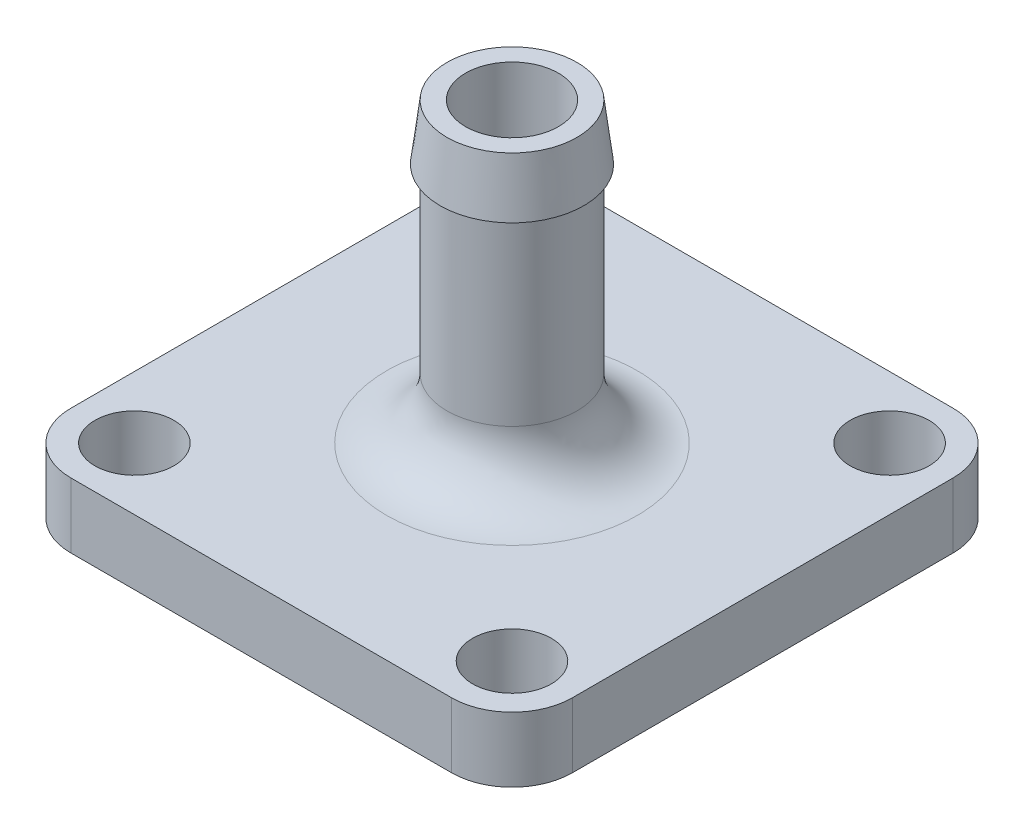
ISO-10303-21;
HEADER;
FILE_DESCRIPTION(('STEP AP214'),'2;1');
FILE_NAME('part.step','',(''),(''),'','','');
FILE_SCHEMA(('AUTOMOTIVE_DESIGN { 1 0 10303 214 1 1 1 1 }'));
ENDSEC;
DATA;
#1=APPLICATION_CONTEXT('core data for automotive mechanical design processes');
#2=APPLICATION_PROTOCOL_DEFINITION('international standard','automotive_design',2000,#1);
#3=PRODUCT_CONTEXT('',#1,'mechanical');
#4=PRODUCT('Part','Part','',(#3));
#5=PRODUCT_RELATED_PRODUCT_CATEGORY('part','',(#4));
#6=PRODUCT_DEFINITION_FORMATION('','',#4);
#7=PRODUCT_DEFINITION_CONTEXT('part definition',#1,'design');
#8=PRODUCT_DEFINITION('design','',#6,#7);
#9=PRODUCT_DEFINITION_SHAPE('','',#8);
#10=(LENGTH_UNIT() NAMED_UNIT(*) SI_UNIT(.MILLI.,.METRE.));
#11=(NAMED_UNIT(*) PLANE_ANGLE_UNIT() SI_UNIT($,.RADIAN.));
#12=(NAMED_UNIT(*) SI_UNIT($,.STERADIAN.) SOLID_ANGLE_UNIT());
#13=UNCERTAINTY_MEASURE_WITH_UNIT(LENGTH_MEASURE(1.E-05),#10,'distance_accuracy_value','');
#14=(GEOMETRIC_REPRESENTATION_CONTEXT(3) GLOBAL_UNCERTAINTY_ASSIGNED_CONTEXT((#13)) GLOBAL_UNIT_ASSIGNED_CONTEXT((#10,
#11,#12)) REPRESENTATION_CONTEXT('',''));
#15=CARTESIAN_POINT('',(0.,0.,0.));
#16=DIRECTION('',(0.,0.,1.));
#17=DIRECTION('',(1.,0.,0.));
#18=AXIS2_PLACEMENT_3D('',#15,#16,#17);
#19=CARTESIAN_POINT('',(0.,33.,0.));
#20=DIRECTION('',(0.,1.,0.));
#21=DIRECTION('',(0.,0.,1.));
#22=AXIS2_PLACEMENT_3D('',#19,#20,#21);
#23=PLANE('',#22);
#24=CARTESIAN_POINT('',(0.,33.,0.));
#25=DIRECTION('',(0.,1.,0.));
#26=DIRECTION('',(0.,0.,1.));
#27=AXIS2_PLACEMENT_3D('',#24,#25,#26);
#28=CIRCLE('',#27,7.);
#29=CARTESIAN_POINT('',(0.,33.,-7.));
#30=VERTEX_POINT('',#29);
#31=EDGE_CURVE('E266',#30,#30,#28,.T.);
#32=ORIENTED_EDGE('',*,*,#31,.T.);
#33=EDGE_LOOP('',(#32));
#34=FACE_BOUND('',#33,.T.);
#35=CARTESIAN_POINT('',(0.,33.,0.));
#36=DIRECTION('',(0.,1.,0.));
#37=DIRECTION('',(0.,0.,1.));
#38=AXIS2_PLACEMENT_3D('',#35,#36,#37);
#39=CIRCLE('',#38,7.73766141390782);
#40=CARTESIAN_POINT('',(0.,33.,7.73766141390782));
#41=VERTEX_POINT('',#40);
#42=EDGE_CURVE('E161',#41,#41,#39,.T.);
#43=ORIENTED_EDGE('',*,*,#42,.F.);
#44=EDGE_LOOP('',(#43));
#45=FACE_BOUND('',#44,.T.);
#46=ADVANCED_FACE('F33',(#34,#45),#23,.F.);
#47=CARTESIAN_POINT('',(0.,7.,0.));
#48=DIRECTION('',(0.,1.,0.));
#49=DIRECTION('',(0.,0.,1.));
#50=AXIS2_PLACEMENT_3D('',#47,#48,#49);
#51=PLANE('',#50);
#52=CARTESIAN_POINT('',(0.,7.,0.));
#53=DIRECTION('',(0.,1.,0.));
#54=DIRECTION('',(0.,0.,1.));
#55=AXIS2_PLACEMENT_3D('',#52,#53,#54);
#56=CIRCLE('',#55,13.5);
#57=CARTESIAN_POINT('',(0.,7.,13.5));
#58=VERTEX_POINT('',#57);
#59=EDGE_CURVE('E168',#58,#58,#56,.F.);
#60=ORIENTED_EDGE('',*,*,#59,.T.);
#61=EDGE_LOOP('',(#60));
#62=FACE_BOUND('',#61,.T.);
#63=CARTESIAN_POINT('',(-20.3293199591132,7.,20.3293199591132));
#64=DIRECTION('',(0.,1.,0.));
#65=DIRECTION('',(0.,0.,1.));
#66=AXIS2_PLACEMENT_3D('',#63,#64,#65);
#67=CIRCLE('',#66,4.25000000000001);
#68=CARTESIAN_POINT('',(-20.3293199591132,7.,24.5793199591133));
#69=VERTEX_POINT('',#68);
#70=EDGE_CURVE('E279',#69,#69,#67,.T.);
#71=ORIENTED_EDGE('',*,*,#70,.F.);
#72=EDGE_LOOP('',(#71));
#73=FACE_BOUND('',#72,.T.);
#74=CARTESIAN_POINT('',(-20.3293199591132,7.,-20.3293199591132));
#75=DIRECTION('',(0.,1.,0.));
#76=DIRECTION('',(0.,0.,1.));
#77=AXIS2_PLACEMENT_3D('',#74,#75,#76);
#78=CIRCLE('',#77,4.25);
#79=CARTESIAN_POINT('',(-20.3293199591132,7.,-16.0793199591132));
#80=VERTEX_POINT('',#79);
#81=EDGE_CURVE('E291',#80,#80,#78,.T.);
#82=ORIENTED_EDGE('',*,*,#81,.F.);
#83=EDGE_LOOP('',(#82));
#84=FACE_BOUND('',#83,.T.);
#85=DIRECTION('',(0.,0.,1.));
#86=VECTOR('',#85,1.);
#87=CARTESIAN_POINT('',(-27.,7.,-27.));
#88=LINE('',#87,#86);
#89=CARTESIAN_POINT('',(-27.,7.,-20.5));
#90=VERTEX_POINT('',#89);
#91=CARTESIAN_POINT('',(-27.,7.,20.5));
#92=VERTEX_POINT('',#91);
#93=EDGE_CURVE('E298',#90,#92,#88,.T.);
#94=ORIENTED_EDGE('',*,*,#93,.T.);
#95=CARTESIAN_POINT('',(-20.5,7.,20.5));
#96=DIRECTION('',(0.,1.,0.));
#97=DIRECTION('',(0.,0.,1.));
#98=AXIS2_PLACEMENT_3D('',#95,#96,#97);
#99=CIRCLE('',#98,6.5);
#100=CARTESIAN_POINT('',(-20.5,7.,27.));
#101=VERTEX_POINT('',#100);
#102=EDGE_CURVE('E149',#92,#101,#99,.T.);
#103=ORIENTED_EDGE('',*,*,#102,.T.);
#104=DIRECTION('',(1.,0.,0.));
#105=VECTOR('',#104,1.);
#106=CARTESIAN_POINT('',(-27.,7.,27.));
#107=LINE('',#106,#105);
#108=CARTESIAN_POINT('',(20.5,7.,27.));
#109=VERTEX_POINT('',#108);
#110=EDGE_CURVE('E120',#101,#109,#107,.T.);
#111=ORIENTED_EDGE('',*,*,#110,.T.);
#112=CARTESIAN_POINT('',(20.5,7.,20.5));
#113=DIRECTION('',(0.,1.,0.));
#114=DIRECTION('',(0.,0.,1.));
#115=AXIS2_PLACEMENT_3D('',#112,#113,#114);
#116=CIRCLE('',#115,6.5);
#117=CARTESIAN_POINT('',(27.,7.,20.5));
#118=VERTEX_POINT('',#117);
#119=EDGE_CURVE('E147',#109,#118,#116,.T.);
#120=ORIENTED_EDGE('',*,*,#119,.T.);
#121=DIRECTION('',(0.,0.,-1.));
#122=VECTOR('',#121,1.);
#123=CARTESIAN_POINT('',(27.,7.,-27.));
#124=LINE('',#123,#122);
#125=CARTESIAN_POINT('',(27.,7.,-20.5));
#126=VERTEX_POINT('',#125);
#127=EDGE_CURVE('E127',#118,#126,#124,.T.);
#128=ORIENTED_EDGE('',*,*,#127,.T.);
#129=CARTESIAN_POINT('',(20.5,7.,-20.5));
#130=DIRECTION('',(0.,1.,0.));
#131=DIRECTION('',(0.,0.,1.));
#132=AXIS2_PLACEMENT_3D('',#129,#130,#131);
#133=CIRCLE('',#132,6.5);
#134=CARTESIAN_POINT('',(20.5,7.,-27.));
#135=VERTEX_POINT('',#134);
#136=EDGE_CURVE('E55',#126,#135,#133,.T.);
#137=ORIENTED_EDGE('',*,*,#136,.T.);
#138=DIRECTION('',(-1.,0.,0.));
#139=VECTOR('',#138,1.);
#140=CARTESIAN_POINT('',(-27.,7.,-27.));
#141=LINE('',#140,#139);
#142=CARTESIAN_POINT('',(-20.5,7.,-27.));
#143=VERTEX_POINT('',#142);
#144=EDGE_CURVE('E130',#135,#143,#141,.T.);
#145=ORIENTED_EDGE('',*,*,#144,.T.);
#146=CARTESIAN_POINT('',(-20.5,7.,-20.5));
#147=DIRECTION('',(0.,1.,0.));
#148=DIRECTION('',(0.,0.,1.));
#149=AXIS2_PLACEMENT_3D('',#146,#147,#148);
#150=CIRCLE('',#149,6.5);
#151=EDGE_CURVE('E144',#143,#90,#150,.T.);
#152=ORIENTED_EDGE('',*,*,#151,.T.);
#153=EDGE_LOOP('',(#94,#103,#111,#120,#128,#137,#145,#152));
#154=FACE_BOUND('',#153,.T.);
#155=CARTESIAN_POINT('',(20.3293199591132,7.,20.3293199591132));
#156=DIRECTION('',(0.,1.,0.));
#157=DIRECTION('',(0.,0.,-1.));
#158=AXIS2_PLACEMENT_3D('',#155,#156,#157);
#159=CIRCLE('',#158,4.25000000000001);
#160=CARTESIAN_POINT('',(20.3293199591132,7.,16.0793199591132));
#161=VERTEX_POINT('',#160);
#162=EDGE_CURVE('E285',#161,#161,#159,.T.);
#163=ORIENTED_EDGE('',*,*,#162,.F.);
#164=EDGE_LOOP('',(#163));
#165=FACE_BOUND('',#164,.T.);
#166=CARTESIAN_POINT('',(20.3293199591132,7.,-20.3293199591133));
#167=DIRECTION('',(0.,1.,0.));
#168=DIRECTION('',(0.,0.,-1.));
#169=AXIS2_PLACEMENT_3D('',#166,#167,#168);
#170=CIRCLE('',#169,4.25);
#171=CARTESIAN_POINT('',(20.3293199591132,7.,-24.5793199591133));
#172=VERTEX_POINT('',#171);
#173=EDGE_CURVE('E270',#172,#172,#170,.T.);
#174=ORIENTED_EDGE('',*,*,#173,.F.);
#175=EDGE_LOOP('',(#174));
#176=FACE_BOUND('',#175,.T.);
#177=ADVANCED_FACE('F191',(#62,#73,#84,#154,#165,#176),#51,.T.);
#178=CARTESIAN_POINT('',(0.,0.,0.));
#179=DIRECTION('',(0.,1.,0.));
#180=DIRECTION('',(0.,0.,1.));
#181=AXIS2_PLACEMENT_3D('',#178,#179,#180);
#182=PLANE('',#181);
#183=CARTESIAN_POINT('',(0.,0.,0.));
#184=DIRECTION('',(0.,1.,0.));
#185=DIRECTION('',(-1.,0.,0.));
#186=AXIS2_PLACEMENT_3D('',#183,#184,#185);
#187=CIRCLE('',#186,14.5);
#188=CARTESIAN_POINT('',(-14.5,0.,0.));
#189=VERTEX_POINT('',#188);
#190=EDGE_CURVE('E172',#189,#189,#187,.T.);
#191=ORIENTED_EDGE('',*,*,#190,.T.);
#192=EDGE_LOOP('',(#191));
#193=FACE_BOUND('',#192,.T.);
#194=DIRECTION('',(1.,0.,0.));
#195=VECTOR('',#194,1.);
#196=CARTESIAN_POINT('',(-27.,0.,27.));
#197=LINE('',#196,#195);
#198=CARTESIAN_POINT('',(-20.5,0.,27.));
#199=VERTEX_POINT('',#198);
#200=CARTESIAN_POINT('',(20.5,0.,27.));
#201=VERTEX_POINT('',#200);
#202=EDGE_CURVE('E117',#199,#201,#197,.T.);
#203=ORIENTED_EDGE('',*,*,#202,.F.);
#204=CARTESIAN_POINT('',(-20.5,0.,20.5));
#205=DIRECTION('',(0.,1.,0.));
#206=DIRECTION('',(0.,0.,1.));
#207=AXIS2_PLACEMENT_3D('',#204,#205,#206);
#208=CIRCLE('',#207,6.5);
#209=CARTESIAN_POINT('',(-27.,0.,20.5));
#210=VERTEX_POINT('',#209);
#211=EDGE_CURVE('E100',#199,#210,#208,.F.);
#212=ORIENTED_EDGE('',*,*,#211,.T.);
#213=DIRECTION('',(0.,0.,1.));
#214=VECTOR('',#213,1.);
#215=CARTESIAN_POINT('',(-27.,0.,-27.));
#216=LINE('',#215,#214);
#217=CARTESIAN_POINT('',(-27.,0.,-20.5));
#218=VERTEX_POINT('',#217);
#219=EDGE_CURVE('E128',#218,#210,#216,.T.);
#220=ORIENTED_EDGE('',*,*,#219,.F.);
#221=CARTESIAN_POINT('',(-20.5,0.,-20.5));
#222=DIRECTION('',(0.,1.,0.));
#223=DIRECTION('',(0.,0.,1.));
#224=AXIS2_PLACEMENT_3D('',#221,#222,#223);
#225=CIRCLE('',#224,6.5);
#226=CARTESIAN_POINT('',(-20.5,0.,-27.));
#227=VERTEX_POINT('',#226);
#228=EDGE_CURVE('E121',#218,#227,#225,.F.);
#229=ORIENTED_EDGE('',*,*,#228,.T.);
#230=DIRECTION('',(-1.,0.,0.));
#231=VECTOR('',#230,1.);
#232=CARTESIAN_POINT('',(-27.,0.,-27.));
#233=LINE('',#232,#231);
#234=CARTESIAN_POINT('',(20.5,0.,-27.));
#235=VERTEX_POINT('',#234);
#236=EDGE_CURVE('E132',#235,#227,#233,.T.);
#237=ORIENTED_EDGE('',*,*,#236,.F.);
#238=CARTESIAN_POINT('',(20.5,0.,-20.5));
#239=DIRECTION('',(0.,1.,0.));
#240=DIRECTION('',(0.,0.,1.));
#241=AXIS2_PLACEMENT_3D('',#238,#239,#240);
#242=CIRCLE('',#241,6.5);
#243=CARTESIAN_POINT('',(27.,0.,-20.5));
#244=VERTEX_POINT('',#243);
#245=EDGE_CURVE('E138',#235,#244,#242,.F.);
#246=ORIENTED_EDGE('',*,*,#245,.T.);
#247=DIRECTION('',(0.,0.,-1.));
#248=VECTOR('',#247,1.);
#249=CARTESIAN_POINT('',(27.,0.,-27.));
#250=LINE('',#249,#248);
#251=CARTESIAN_POINT('',(27.,0.,20.5));
#252=VERTEX_POINT('',#251);
#253=EDGE_CURVE('E294',#252,#244,#250,.T.);
#254=ORIENTED_EDGE('',*,*,#253,.F.);
#255=CARTESIAN_POINT('',(20.5,0.,20.5));
#256=DIRECTION('',(0.,1.,0.));
#257=DIRECTION('',(0.,0.,1.));
#258=AXIS2_PLACEMENT_3D('',#255,#256,#257);
#259=CIRCLE('',#258,6.5);
#260=EDGE_CURVE('E111',#252,#201,#259,.F.);
#261=ORIENTED_EDGE('',*,*,#260,.T.);
#262=EDGE_LOOP('',(#203,#212,#220,#229,#237,#246,#254,#261));
#263=FACE_BOUND('',#262,.T.);
#264=CARTESIAN_POINT('',(-20.3293199591132,0.,-20.3293199591132));
#265=DIRECTION('',(0.,1.,0.));
#266=DIRECTION('',(0.,0.,1.));
#267=AXIS2_PLACEMENT_3D('',#264,#265,#266);
#268=CIRCLE('',#267,4.25);
#269=CARTESIAN_POINT('',(-20.3293199591132,0.,-16.0793199591132));
#270=VERTEX_POINT('',#269);
#271=EDGE_CURVE('E288',#270,#270,#268,.T.);
#272=ORIENTED_EDGE('',*,*,#271,.T.);
#273=EDGE_LOOP('',(#272));
#274=FACE_BOUND('',#273,.T.);
#275=CARTESIAN_POINT('',(20.3293199591132,0.,20.3293199591132));
#276=DIRECTION('',(0.,1.,0.));
#277=DIRECTION('',(0.,0.,-1.));
#278=AXIS2_PLACEMENT_3D('',#275,#276,#277);
#279=CIRCLE('',#278,4.25000000000001);
#280=CARTESIAN_POINT('',(20.3293199591132,0.,16.0793199591132));
#281=VERTEX_POINT('',#280);
#282=EDGE_CURVE('E282',#281,#281,#279,.T.);
#283=ORIENTED_EDGE('',*,*,#282,.T.);
#284=EDGE_LOOP('',(#283));
#285=FACE_BOUND('',#284,.T.);
#286=CARTESIAN_POINT('',(-20.3293199591132,0.,20.3293199591132));
#287=DIRECTION('',(0.,1.,0.));
#288=DIRECTION('',(0.,0.,1.));
#289=AXIS2_PLACEMENT_3D('',#286,#287,#288);
#290=CIRCLE('',#289,4.25000000000001);
#291=CARTESIAN_POINT('',(-20.3293199591132,0.,24.5793199591133));
#292=VERTEX_POINT('',#291);
#293=EDGE_CURVE('E277',#292,#292,#290,.T.);
#294=ORIENTED_EDGE('',*,*,#293,.T.);
#295=EDGE_LOOP('',(#294));
#296=FACE_BOUND('',#295,.T.);
#297=CARTESIAN_POINT('',(20.3293199591132,0.,-20.3293199591133));
#298=DIRECTION('',(0.,1.,0.));
#299=DIRECTION('',(0.,0.,-1.));
#300=AXIS2_PLACEMENT_3D('',#297,#298,#299);
#301=CIRCLE('',#300,4.25);
#302=CARTESIAN_POINT('',(20.3293199591132,0.,-24.5793199591133));
#303=VERTEX_POINT('',#302);
#304=EDGE_CURVE('E267',#303,#303,#301,.T.);
#305=ORIENTED_EDGE('',*,*,#304,.T.);
#306=EDGE_LOOP('',(#305));
#307=FACE_BOUND('',#306,.T.);
#308=ADVANCED_FACE('F124',(#193,#263,#274,#285,#296,#307),#182,.F.);
#309=CARTESIAN_POINT('',(27.,7.,-27.));
#310=DIRECTION('',(-1.,0.,0.));
#311=DIRECTION('',(0.,0.,1.));
#312=AXIS2_PLACEMENT_3D('',#309,#310,#311);
#313=PLANE('',#312);
#314=ORIENTED_EDGE('',*,*,#127,.F.);
#315=DIRECTION('',(0.,-1.,0.));
#316=VECTOR('',#315,1.);
#317=CARTESIAN_POINT('',(27.,7.,20.5));
#318=LINE('',#317,#316);
#319=EDGE_CURVE('E153',#118,#252,#318,.T.);
#320=ORIENTED_EDGE('',*,*,#319,.T.);
#321=ORIENTED_EDGE('',*,*,#253,.T.);
#322=DIRECTION('',(0.,-1.,0.));
#323=VECTOR('',#322,1.);
#324=CARTESIAN_POINT('',(27.,7.,-20.5));
#325=LINE('',#324,#323);
#326=EDGE_CURVE('E151',#244,#126,#325,.F.);
#327=ORIENTED_EDGE('',*,*,#326,.T.);
#328=EDGE_LOOP('',(#314,#320,#321,#327));
#329=FACE_BOUND('',#328,.T.);
#330=ADVANCED_FACE('F229',(#329),#313,.F.);
#331=CARTESIAN_POINT('',(-27.,7.,-27.));
#332=DIRECTION('',(0.,0.,1.));
#333=DIRECTION('',(1.,0.,0.));
#334=AXIS2_PLACEMENT_3D('',#331,#332,#333);
#335=PLANE('',#334);
#336=ORIENTED_EDGE('',*,*,#144,.F.);
#337=DIRECTION('',(0.,-1.,0.));
#338=VECTOR('',#337,1.);
#339=CARTESIAN_POINT('',(20.5,7.,-27.));
#340=LINE('',#339,#338);
#341=EDGE_CURVE('E157',#135,#235,#340,.T.);
#342=ORIENTED_EDGE('',*,*,#341,.T.);
#343=ORIENTED_EDGE('',*,*,#236,.T.);
#344=DIRECTION('',(0.,-1.,0.));
#345=VECTOR('',#344,1.);
#346=CARTESIAN_POINT('',(-20.5,7.,-27.));
#347=LINE('',#346,#345);
#348=EDGE_CURVE('E48',#227,#143,#347,.F.);
#349=ORIENTED_EDGE('',*,*,#348,.T.);
#350=EDGE_LOOP('',(#336,#342,#343,#349));
#351=FACE_BOUND('',#350,.T.);
#352=ADVANCED_FACE('F236',(#351),#335,.F.);
#353=CARTESIAN_POINT('',(-27.,7.,-27.));
#354=DIRECTION('',(1.,0.,0.));
#355=DIRECTION('',(0.,0.,-1.));
#356=AXIS2_PLACEMENT_3D('',#353,#354,#355);
#357=PLANE('',#356);
#358=ORIENTED_EDGE('',*,*,#219,.T.);
#359=DIRECTION('',(0.,-1.,0.));
#360=VECTOR('',#359,1.);
#361=CARTESIAN_POINT('',(-27.,7.,20.5));
#362=LINE('',#361,#360);
#363=EDGE_CURVE('E105',#210,#92,#362,.F.);
#364=ORIENTED_EDGE('',*,*,#363,.T.);
#365=ORIENTED_EDGE('',*,*,#93,.F.);
#366=DIRECTION('',(0.,-1.,0.));
#367=VECTOR('',#366,1.);
#368=CARTESIAN_POINT('',(-27.,7.,-20.5));
#369=LINE('',#368,#367);
#370=EDGE_CURVE('E110',#90,#218,#369,.T.);
#371=ORIENTED_EDGE('',*,*,#370,.T.);
#372=EDGE_LOOP('',(#358,#364,#365,#371));
#373=FACE_BOUND('',#372,.T.);
#374=ADVANCED_FACE('F233',(#373),#357,.F.);
#375=CARTESIAN_POINT('',(-27.,7.,27.));
#376=DIRECTION('',(0.,0.,-1.));
#377=DIRECTION('',(-1.,0.,0.));
#378=AXIS2_PLACEMENT_3D('',#375,#376,#377);
#379=PLANE('',#378);
#380=ORIENTED_EDGE('',*,*,#110,.F.);
#381=DIRECTION('',(0.,-1.,0.));
#382=VECTOR('',#381,1.);
#383=CARTESIAN_POINT('',(-20.5,7.,27.));
#384=LINE('',#383,#382);
#385=EDGE_CURVE('E104',#101,#199,#384,.T.);
#386=ORIENTED_EDGE('',*,*,#385,.T.);
#387=ORIENTED_EDGE('',*,*,#202,.T.);
#388=DIRECTION('',(0.,-1.,0.));
#389=VECTOR('',#388,1.);
#390=CARTESIAN_POINT('',(20.5,7.,27.));
#391=LINE('',#390,#389);
#392=EDGE_CURVE('E122',#201,#109,#391,.F.);
#393=ORIENTED_EDGE('',*,*,#392,.T.);
#394=EDGE_LOOP('',(#380,#386,#387,#393));
#395=FACE_BOUND('',#394,.T.);
#396=ADVANCED_FACE('F116',(#395),#379,.F.);
#397=CARTESIAN_POINT('',(-20.3293199591132,7.,-20.3293199591132));
#398=DIRECTION('',(0.,-1.,0.));
#399=DIRECTION('',(0.,0.,-1.));
#400=AXIS2_PLACEMENT_3D('',#397,#398,#399);
#401=CYLINDRICAL_SURFACE('',#400,4.25);
#402=ORIENTED_EDGE('',*,*,#81,.T.);
#403=EDGE_LOOP('',(#402));
#404=FACE_BOUND('',#403,.T.);
#405=ORIENTED_EDGE('',*,*,#271,.F.);
#406=EDGE_LOOP('',(#405));
#407=FACE_BOUND('',#406,.T.);
#408=ADVANCED_FACE('F222',(#404,#407),#401,.F.);
#409=CARTESIAN_POINT('',(20.3293199591132,7.,20.3293199591132));
#410=DIRECTION('',(0.,-1.,0.));
#411=DIRECTION('',(0.,0.,-1.));
#412=AXIS2_PLACEMENT_3D('',#409,#410,#411);
#413=CYLINDRICAL_SURFACE('',#412,4.25000000000001);
#414=ORIENTED_EDGE('',*,*,#162,.T.);
#415=EDGE_LOOP('',(#414));
#416=FACE_BOUND('',#415,.T.);
#417=ORIENTED_EDGE('',*,*,#282,.F.);
#418=EDGE_LOOP('',(#417));
#419=FACE_BOUND('',#418,.T.);
#420=ADVANCED_FACE('F218',(#416,#419),#413,.F.);
#421=CARTESIAN_POINT('',(-20.3293199591132,7.,20.3293199591132));
#422=DIRECTION('',(0.,-1.,0.));
#423=DIRECTION('',(0.,0.,-1.));
#424=AXIS2_PLACEMENT_3D('',#421,#422,#423);
#425=CYLINDRICAL_SURFACE('',#424,4.25000000000001);
#426=ORIENTED_EDGE('',*,*,#70,.T.);
#427=EDGE_LOOP('',(#426));
#428=FACE_BOUND('',#427,.T.);
#429=ORIENTED_EDGE('',*,*,#293,.F.);
#430=EDGE_LOOP('',(#429));
#431=FACE_BOUND('',#430,.T.);
#432=ADVANCED_FACE('F214',(#428,#431),#425,.F.);
#433=CARTESIAN_POINT('',(20.3293199591132,7.,-20.3293199591133));
#434=DIRECTION('',(0.,-1.,0.));
#435=DIRECTION('',(0.,0.,-1.));
#436=AXIS2_PLACEMENT_3D('',#433,#434,#435);
#437=CYLINDRICAL_SURFACE('',#436,4.25);
#438=ORIENTED_EDGE('',*,*,#173,.T.);
#439=EDGE_LOOP('',(#438));
#440=FACE_BOUND('',#439,.T.);
#441=ORIENTED_EDGE('',*,*,#304,.F.);
#442=EDGE_LOOP('',(#441));
#443=FACE_BOUND('',#442,.T.);
#444=ADVANCED_FACE('F211',(#440,#443),#437,.F.);
#445=CARTESIAN_POINT('',(-20.5,7.,20.5));
#446=DIRECTION('',(0.,-1.,0.));
#447=DIRECTION('',(0.,0.,-1.));
#448=AXIS2_PLACEMENT_3D('',#445,#446,#447);
#449=CYLINDRICAL_SURFACE('',#448,6.5);
#450=ORIENTED_EDGE('',*,*,#102,.F.);
#451=ORIENTED_EDGE('',*,*,#363,.F.);
#452=ORIENTED_EDGE('',*,*,#211,.F.);
#453=ORIENTED_EDGE('',*,*,#385,.F.);
#454=EDGE_LOOP('',(#450,#451,#452,#453));
#455=FACE_BOUND('',#454,.T.);
#456=ADVANCED_FACE('F103',(#455),#449,.T.);
#457=CARTESIAN_POINT('',(20.5,7.,20.5));
#458=DIRECTION('',(0.,-1.,0.));
#459=DIRECTION('',(0.,0.,-1.));
#460=AXIS2_PLACEMENT_3D('',#457,#458,#459);
#461=CYLINDRICAL_SURFACE('',#460,6.5);
#462=ORIENTED_EDGE('',*,*,#119,.F.);
#463=ORIENTED_EDGE('',*,*,#392,.F.);
#464=ORIENTED_EDGE('',*,*,#260,.F.);
#465=ORIENTED_EDGE('',*,*,#319,.F.);
#466=EDGE_LOOP('',(#462,#463,#464,#465));
#467=FACE_BOUND('',#466,.T.);
#468=ADVANCED_FACE('F245',(#467),#461,.T.);
#469=CARTESIAN_POINT('',(20.5,7.,-20.5));
#470=DIRECTION('',(0.,-1.,0.));
#471=DIRECTION('',(0.,0.,-1.));
#472=AXIS2_PLACEMENT_3D('',#469,#470,#471);
#473=CYLINDRICAL_SURFACE('',#472,6.5);
#474=ORIENTED_EDGE('',*,*,#136,.F.);
#475=ORIENTED_EDGE('',*,*,#326,.F.);
#476=ORIENTED_EDGE('',*,*,#245,.F.);
#477=ORIENTED_EDGE('',*,*,#341,.F.);
#478=EDGE_LOOP('',(#474,#475,#476,#477));
#479=FACE_BOUND('',#478,.T.);
#480=ADVANCED_FACE('F248',(#479),#473,.T.);
#481=CARTESIAN_POINT('',(-20.5,7.,-20.5));
#482=DIRECTION('',(0.,-1.,0.));
#483=DIRECTION('',(0.,0.,-1.));
#484=AXIS2_PLACEMENT_3D('',#481,#482,#483);
#485=CYLINDRICAL_SURFACE('',#484,6.5);
#486=ORIENTED_EDGE('',*,*,#151,.F.);
#487=ORIENTED_EDGE('',*,*,#348,.F.);
#488=ORIENTED_EDGE('',*,*,#228,.F.);
#489=ORIENTED_EDGE('',*,*,#370,.F.);
#490=EDGE_LOOP('',(#486,#487,#488,#489));
#491=FACE_BOUND('',#490,.T.);
#492=ADVANCED_FACE('F209',(#491),#485,.T.);
#493=CARTESIAN_POINT('',(0.,33.,0.));
#494=DIRECTION('',(0.,-1.,0.));
#495=DIRECTION('',(0.,0.,-1.));
#496=AXIS2_PLACEMENT_3D('',#493,#494,#495);
#497=CYLINDRICAL_SURFACE('',#496,7.);
#498=CARTESIAN_POINT('',(0.,13.5,0.));
#499=DIRECTION('',(0.,1.,0.));
#500=DIRECTION('',(0.,0.,1.));
#501=AXIS2_PLACEMENT_3D('',#498,#499,#500);
#502=CIRCLE('',#501,7.);
#503=CARTESIAN_POINT('',(0.,13.5,-7.));
#504=VERTEX_POINT('',#503);
#505=EDGE_CURVE('E160',#504,#504,#502,.T.);
#506=CARTESIAN_POINT('',(0.,13.5,-7.));
#507=CARTESIAN_POINT('',(0.,13.703125,-7.));
#508=CARTESIAN_POINT('',(0.,13.90625,-7.));
#509=CARTESIAN_POINT('',(0.,14.3125,-7.));
#510=CARTESIAN_POINT('',(0.,14.515625,-7.));
#511=CARTESIAN_POINT('',(0.,14.921875,-7.));
#512=CARTESIAN_POINT('',(0.,15.125,-7.));
#513=CARTESIAN_POINT('',(0.,15.53125,-7.));
#514=CARTESIAN_POINT('',(0.,15.734375,-7.));
#515=CARTESIAN_POINT('',(0.,16.140625,-7.));
#516=CARTESIAN_POINT('',(0.,16.34375,-7.));
#517=CARTESIAN_POINT('',(0.,16.75,-7.));
#518=CARTESIAN_POINT('',(0.,16.953125,-7.));
#519=CARTESIAN_POINT('',(0.,17.359375,-7.));
#520=CARTESIAN_POINT('',(0.,17.5625,-7.));
#521=CARTESIAN_POINT('',(0.,17.96875,-7.));
#522=CARTESIAN_POINT('',(0.,18.171875,-7.));
#523=CARTESIAN_POINT('',(0.,18.578125,-7.));
#524=CARTESIAN_POINT('',(0.,18.78125,-7.));
#525=CARTESIAN_POINT('',(0.,19.1875,-7.));
#526=CARTESIAN_POINT('',(0.,19.390625,-7.));
#527=CARTESIAN_POINT('',(0.,19.796875,-7.));
#528=CARTESIAN_POINT('',(0.,20.,-7.));
#529=CARTESIAN_POINT('',(0.,20.40625,-7.));
#530=CARTESIAN_POINT('',(0.,20.609375,-7.));
#531=CARTESIAN_POINT('',(0.,21.015625,-7.));
#532=CARTESIAN_POINT('',(0.,21.21875,-7.));
#533=CARTESIAN_POINT('',(0.,21.625,-7.));
#534=CARTESIAN_POINT('',(0.,21.828125,-7.));
#535=CARTESIAN_POINT('',(0.,22.234375,-7.));
#536=CARTESIAN_POINT('',(0.,22.4375,-7.));
#537=CARTESIAN_POINT('',(0.,22.84375,-7.));
#538=CARTESIAN_POINT('',(0.,23.046875,-7.));
#539=CARTESIAN_POINT('',(0.,23.453125,-7.));
#540=CARTESIAN_POINT('',(0.,23.65625,-7.));
#541=CARTESIAN_POINT('',(0.,24.0625,-7.));
#542=CARTESIAN_POINT('',(0.,24.265625,-7.));
#543=CARTESIAN_POINT('',(0.,24.671875,-7.));
#544=CARTESIAN_POINT('',(0.,24.875,-7.));
#545=CARTESIAN_POINT('',(0.,25.28125,-7.));
#546=CARTESIAN_POINT('',(0.,25.484375,-7.));
#547=CARTESIAN_POINT('',(0.,25.890625,-7.));
#548=CARTESIAN_POINT('',(0.,26.09375,-7.));
#549=CARTESIAN_POINT('',(0.,26.5,-7.));
#550=CARTESIAN_POINT('',(0.,26.703125,-7.));
#551=CARTESIAN_POINT('',(0.,27.109375,-7.));
#552=CARTESIAN_POINT('',(0.,27.3125,-7.));
#553=CARTESIAN_POINT('',(0.,27.71875,-7.));
#554=CARTESIAN_POINT('',(0.,27.921875,-7.));
#555=CARTESIAN_POINT('',(0.,28.328125,-7.));
#556=CARTESIAN_POINT('',(0.,28.53125,-7.));
#557=CARTESIAN_POINT('',(0.,28.9375,-7.));
#558=CARTESIAN_POINT('',(0.,29.140625,-7.));
#559=CARTESIAN_POINT('',(0.,29.546875,-7.));
#560=CARTESIAN_POINT('',(0.,29.75,-7.));
#561=CARTESIAN_POINT('',(0.,30.15625,-7.));
#562=CARTESIAN_POINT('',(0.,30.359375,-7.));
#563=CARTESIAN_POINT('',(0.,30.765625,-7.));
#564=CARTESIAN_POINT('',(0.,30.96875,-7.));
#565=CARTESIAN_POINT('',(0.,31.375,-7.));
#566=CARTESIAN_POINT('',(0.,31.578125,-7.));
#567=CARTESIAN_POINT('',(0.,31.984375,-7.));
#568=CARTESIAN_POINT('',(0.,32.1875,-7.));
#569=CARTESIAN_POINT('',(0.,32.59375,-7.));
#570=CARTESIAN_POINT('',(0.,32.796875,-7.));
#571=CARTESIAN_POINT('',(0.,33.,-7.));
#572=B_SPLINE_CURVE_WITH_KNOTS('',3,(#506,#507,#508,#509,#510,#511,#512,#513,#514,#515,#516,
#517,#518,#519,#520,#521,#522,#523,#524,#525,#526,#527,#528,#529,#530,#531,#532,#533,#534,#535,
#536,#537,#538,#539,#540,#541,#542,#543,#544,#545,#546,#547,#548,#549,#550,#551,#552,#553,#554,
#555,#556,#557,#558,#559,#560,#561,#562,#563,#564,#565,#566,#567,#568,#569,#570,#571),
.UNSPECIFIED.,.F.,.F.,(4,2,2,2,2,2,2,2,2,2,2,2,2,2,2,2,2,2,2,2,2,2,2,2,2,2,2,2,2,2,2,2,4),(0.,
0.609374999999999,1.21875,1.828125,2.4375,3.046875,3.65625,4.265625,4.875,5.484375,6.09375,
6.703125,7.3125,7.921875,8.53125,9.140625,9.75,10.359375,10.96875,11.578125,12.1875,12.796875,
13.40625,14.015625,14.625,15.234375,15.84375,16.453125,17.0625,17.671875,18.28125,18.890625,
19.5),.UNSPECIFIED.);
#573=EDGE_CURVE('BSEAM205',#504,#30,#572,.T.);
#574=ORIENTED_EDGE('',*,*,#505,.T.);
#575=ORIENTED_EDGE('',*,*,#31,.F.);
#576=ORIENTED_EDGE('',*,*,#573,.T.);
#577=ORIENTED_EDGE('',*,*,#573,.F.);
#578=EDGE_LOOP('',(#574,#576,#575,#577));
#579=FACE_BOUND('',#578,.T.);
#580=ADVANCED_FACE('F205',(#579),#497,.T.);
#581=CARTESIAN_POINT('',(0.,39.8469800831978,0.));
#582=DIRECTION('',(0.,-1.,0.));
#583=DIRECTION('',(0.,0.,-1.));
#584=AXIS2_PLACEMENT_3D('',#581,#582,#583);
#585=CONICAL_SURFACE('',#584,6.89586924571276,0.122329691097418);
#586=CARTESIAN_POINT('',(0.,39.,0.));
#587=DIRECTION('',(0.,1.,0.));
#588=DIRECTION('',(0.,0.,1.));
#589=AXIS2_PLACEMENT_3D('',#586,#587,#588);
#590=CIRCLE('',#589,7.);
#591=CARTESIAN_POINT('',(0.,39.,7.));
#592=VERTEX_POINT('',#591);
#593=EDGE_CURVE('E164',#592,#592,#590,.T.);
#594=ORIENTED_EDGE('',*,*,#593,.F.);
#595=EDGE_LOOP('',(#594));
#596=FACE_BOUND('',#595,.T.);
#597=ORIENTED_EDGE('',*,*,#42,.T.);
#598=EDGE_LOOP('',(#597));
#599=FACE_BOUND('',#598,.T.);
#600=ADVANCED_FACE('F208',(#596,#599),#585,.T.);
#601=CARTESIAN_POINT('',(0.,39.,0.));
#602=DIRECTION('',(0.,1.,0.));
#603=DIRECTION('',(0.,0.,1.));
#604=AXIS2_PLACEMENT_3D('',#601,#602,#603);
#605=PLANE('',#604);
#606=CARTESIAN_POINT('',(0.,39.,0.));
#607=DIRECTION('',(0.,1.,0.));
#608=DIRECTION('',(0.,0.,1.));
#609=AXIS2_PLACEMENT_3D('',#606,#607,#608);
#610=CIRCLE('',#609,5.);
#611=CARTESIAN_POINT('',(0.,39.,5.));
#612=VERTEX_POINT('',#611);
#613=EDGE_CURVE('E165',#612,#612,#610,.F.);
#614=ORIENTED_EDGE('',*,*,#613,.T.);
#615=EDGE_LOOP('',(#614));
#616=FACE_BOUND('',#615,.T.);
#617=ORIENTED_EDGE('',*,*,#593,.T.);
#618=EDGE_LOOP('',(#617));
#619=FACE_BOUND('',#618,.T.);
#620=ADVANCED_FACE('F203',(#616,#619),#605,.T.);
#621=CARTESIAN_POINT('',(0.,13.5,0.));
#622=DIRECTION('',(0.,1.,0.));
#623=DIRECTION('',(0.,0.,1.));
#624=AXIS2_PLACEMENT_3D('',#621,#622,#623);
#625=TOROIDAL_SURFACE('',#624,13.5,6.5);
#626=ORIENTED_EDGE('',*,*,#59,.F.);
#627=EDGE_LOOP('',(#626));
#628=FACE_BOUND('',#627,.T.);
#629=ORIENTED_EDGE('',*,*,#505,.F.);
#630=EDGE_LOOP('',(#629));
#631=FACE_BOUND('',#630,.T.);
#632=ADVANCED_FACE('F187',(#628,#631),#625,.F.);
#633=CARTESIAN_POINT('',(0.,41.6736625226973,0.));
#634=DIRECTION('',(0.,1.,0.));
#635=DIRECTION('',(-1.,0.,0.));
#636=AXIS2_PLACEMENT_3D('',#633,#634,#635);
#637=CYLINDRICAL_SURFACE('',#636,5.);
#638=CARTESIAN_POINT('',(0.,11.5,0.));
#639=DIRECTION('',(0.,-1.,0.));
#640=DIRECTION('',(1.,0.,0.));
#641=AXIS2_PLACEMENT_3D('',#638,#639,#640);
#642=CIRCLE('',#641,5.);
#643=CARTESIAN_POINT('',(5.,11.5,0.));
#644=VERTEX_POINT('',#643);
#645=EDGE_CURVE('E41',#644,#644,#642,.T.);
#646=ORIENTED_EDGE('',*,*,#645,.T.);
#647=EDGE_LOOP('',(#646));
#648=FACE_BOUND('',#647,.T.);
#649=ORIENTED_EDGE('',*,*,#613,.F.);
#650=EDGE_LOOP('',(#649));
#651=FACE_BOUND('',#650,.T.);
#652=ADVANCED_FACE('F176',(#648,#651),#637,.F.);
#653=CARTESIAN_POINT('',(0.,11.5,0.));
#654=DIRECTION('',(0.,-1.,0.));
#655=DIRECTION('',(1.,0.,0.));
#656=AXIS2_PLACEMENT_3D('',#653,#654,#655);
#657=TOROIDAL_SURFACE('',#656,11.5,6.5);
#658=CARTESIAN_POINT('',(0.,5.22838234555999,0.));
#659=DIRECTION('',(0.,1.,0.));
#660=DIRECTION('',(-1.,0.,0.));
#661=AXIS2_PLACEMENT_3D('',#658,#659,#660);
#662=CIRCLE('',#661,9.79213232464671);
#663=CARTESIAN_POINT('',(-9.79213232464671,5.22838234555999,0.));
#664=VERTEX_POINT('',#663);
#665=EDGE_CURVE('E11',#664,#664,#662,.F.);
#666=ORIENTED_EDGE('',*,*,#665,.T.);
#667=EDGE_LOOP('',(#666));
#668=FACE_BOUND('',#667,.T.);
#669=ORIENTED_EDGE('',*,*,#645,.F.);
#670=EDGE_LOOP('',(#669));
#671=FACE_BOUND('',#670,.T.);
#672=ADVANCED_FACE('F179',(#668,#671),#657,.T.);
#673=CARTESIAN_POINT('',(0.,-1.04323530887998,0.));
#674=DIRECTION('',(0.,-1.,0.));
#675=DIRECTION('',(1.,0.,0.));
#676=AXIS2_PLACEMENT_3D('',#673,#674,#675);
#677=TOROIDAL_SURFACE('',#676,8.08426464929343,6.5);
#678=ORIENTED_EDGE('',*,*,#665,.F.);
#679=EDGE_LOOP('',(#678));
#680=FACE_BOUND('',#679,.T.);
#681=ORIENTED_EDGE('',*,*,#190,.F.);
#682=EDGE_LOOP('',(#681));
#683=FACE_BOUND('',#682,.T.);
#684=ADVANCED_FACE('F35',(#680,#683),#677,.F.);
#685=CLOSED_SHELL('',(#46,#177,#308,#330,#352,#374,#396,#408,#420,#432,#444,#456,#468,#480,#492,
#580,#600,#620,#632,#652,#672,#684));
#686=MANIFOLD_SOLID_BREP('B2',#685);
#687=ADVANCED_BREP_SHAPE_REPRESENTATION('',(#18,#686),#14);
#688=SHAPE_DEFINITION_REPRESENTATION(#9,#687);
ENDSEC;
END-ISO-10303-21;
